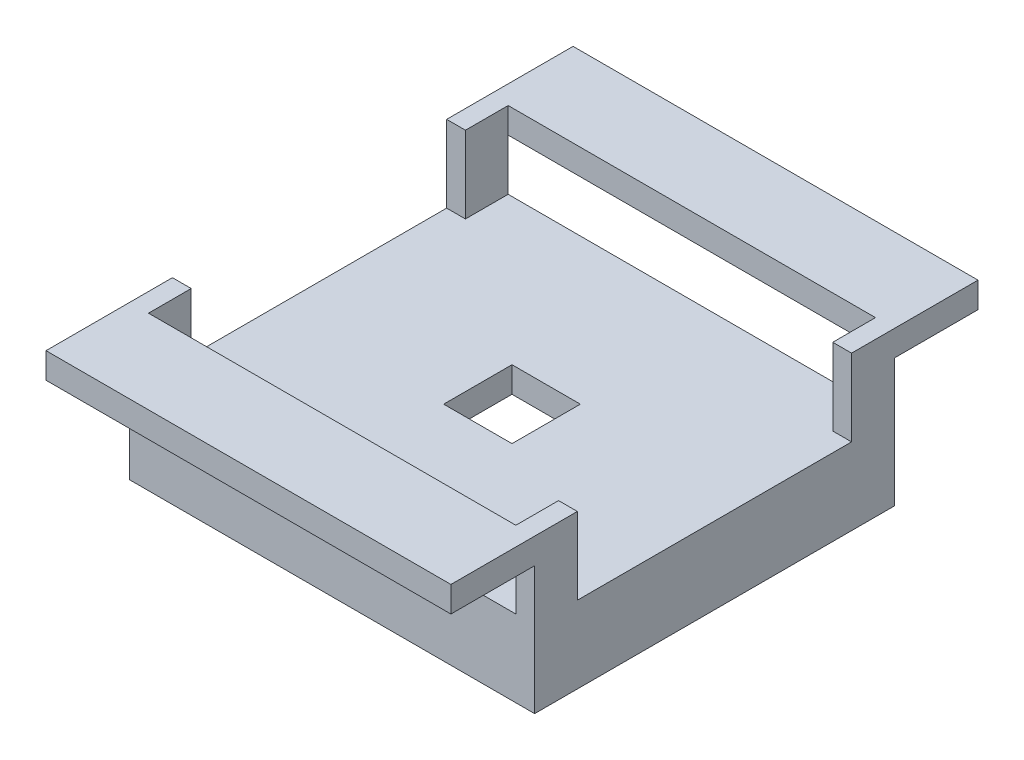
ISO-10303-21;
HEADER;
FILE_DESCRIPTION(('STEP AP214'),'2;1');
FILE_NAME('part.step','',(''),(''),'','','');
FILE_SCHEMA(('AUTOMOTIVE_DESIGN { 1 0 10303 214 1 1 1 1 }'));
ENDSEC;
DATA;
#1=APPLICATION_CONTEXT('core data for automotive mechanical design processes');
#2=APPLICATION_PROTOCOL_DEFINITION('international standard','automotive_design',2000,#1);
#3=PRODUCT_CONTEXT('',#1,'mechanical');
#4=PRODUCT('Part','Part','',(#3));
#5=PRODUCT_RELATED_PRODUCT_CATEGORY('part','',(#4));
#6=PRODUCT_DEFINITION_FORMATION('','',#4);
#7=PRODUCT_DEFINITION_CONTEXT('part definition',#1,'design');
#8=PRODUCT_DEFINITION('design','',#6,#7);
#9=PRODUCT_DEFINITION_SHAPE('','',#8);
#10=(LENGTH_UNIT() NAMED_UNIT(*) SI_UNIT(.MILLI.,.METRE.));
#11=(NAMED_UNIT(*) PLANE_ANGLE_UNIT() SI_UNIT($,.RADIAN.));
#12=(NAMED_UNIT(*) SI_UNIT($,.STERADIAN.) SOLID_ANGLE_UNIT());
#13=UNCERTAINTY_MEASURE_WITH_UNIT(LENGTH_MEASURE(1.E-05),#10,'distance_accuracy_value','');
#14=(GEOMETRIC_REPRESENTATION_CONTEXT(3) GLOBAL_UNCERTAINTY_ASSIGNED_CONTEXT((#13)) GLOBAL_UNIT_ASSIGNED_CONTEXT((#10,
#11,#12)) REPRESENTATION_CONTEXT('',''));
#15=CARTESIAN_POINT('',(0.,0.,0.));
#16=DIRECTION('',(0.,0.,1.));
#17=DIRECTION('',(1.,0.,0.));
#18=AXIS2_PLACEMENT_3D('',#15,#16,#17);
#19=CARTESIAN_POINT('',(-23.7,-1.,21.05));
#20=DIRECTION('',(0.,0.,1.));
#21=DIRECTION('',(1.,0.,0.));
#22=AXIS2_PLACEMENT_3D('',#19,#20,#21);
#23=PLANE('',#22);
#24=DIRECTION('',(0.,1.,0.));
#25=VECTOR('',#24,1.);
#26=CARTESIAN_POINT('',(23.7,-1.,21.05));
#27=LINE('',#26,#25);
#28=CARTESIAN_POINT('',(23.7,-7.,21.05));
#29=VERTEX_POINT('',#28);
#30=CARTESIAN_POINT('',(23.7,8.,21.05));
#31=VERTEX_POINT('',#30);
#32=EDGE_CURVE('E12',#29,#31,#27,.T.);
#33=ORIENTED_EDGE('',*,*,#32,.T.);
#34=DIRECTION('',(1.,0.,0.));
#35=VECTOR('',#34,1.);
#36=CARTESIAN_POINT('',(21.5,8.,21.05));
#37=LINE('',#36,#35);
#38=CARTESIAN_POINT('',(21.5,8.,21.05));
#39=VERTEX_POINT('',#38);
#40=EDGE_CURVE('E404',#39,#31,#37,.T.);
#41=ORIENTED_EDGE('',*,*,#40,.F.);
#42=DIRECTION('',(0.,-1.,0.));
#43=VECTOR('',#42,1.);
#44=CARTESIAN_POINT('',(21.5,11.,21.05));
#45=LINE('',#44,#43);
#46=CARTESIAN_POINT('',(21.5,2.,21.05));
#47=VERTEX_POINT('',#46);
#48=EDGE_CURVE('E375',#39,#47,#45,.T.);
#49=ORIENTED_EDGE('',*,*,#48,.T.);
#50=DIRECTION('',(1.,0.,0.));
#51=VECTOR('',#50,1.);
#52=CARTESIAN_POINT('',(-23.7,2.,21.05));
#53=LINE('',#52,#51);
#54=CARTESIAN_POINT('',(-21.5,2.,21.05));
#55=VERTEX_POINT('',#54);
#56=EDGE_CURVE('E185',#55,#47,#53,.T.);
#57=ORIENTED_EDGE('',*,*,#56,.F.);
#58=DIRECTION('',(0.,-1.,0.));
#59=VECTOR('',#58,1.);
#60=CARTESIAN_POINT('',(-21.5,11.,21.05));
#61=LINE('',#60,#59);
#62=CARTESIAN_POINT('',(-21.5,8.,21.05));
#63=VERTEX_POINT('',#62);
#64=EDGE_CURVE('E313',#63,#55,#61,.T.);
#65=ORIENTED_EDGE('',*,*,#64,.F.);
#66=DIRECTION('',(-1.,0.,0.));
#67=VECTOR('',#66,1.);
#68=CARTESIAN_POINT('',(-21.5,8.,21.05));
#69=LINE('',#68,#67);
#70=CARTESIAN_POINT('',(-23.7,8.,21.05));
#71=VERTEX_POINT('',#70);
#72=EDGE_CURVE('E352',#63,#71,#69,.T.);
#73=ORIENTED_EDGE('',*,*,#72,.T.);
#74=DIRECTION('',(0.,1.,0.));
#75=VECTOR('',#74,1.);
#76=CARTESIAN_POINT('',(-23.7,-1.,21.05));
#77=LINE('',#76,#75);
#78=CARTESIAN_POINT('',(-23.7,-7.,21.05));
#79=VERTEX_POINT('',#78);
#80=EDGE_CURVE('E64',#79,#71,#77,.T.);
#81=ORIENTED_EDGE('',*,*,#80,.F.);
#82=DIRECTION('',(1.,0.,0.));
#83=VECTOR('',#82,1.);
#84=CARTESIAN_POINT('',(0.,-7.,21.05));
#85=LINE('',#84,#83);
#86=EDGE_CURVE('E156',#29,#79,#85,.F.);
#87=ORIENTED_EDGE('',*,*,#86,.F.);
#88=EDGE_LOOP('',(#33,#41,#49,#57,#65,#73,#81,#87));
#89=FACE_BOUND('',#88,.T.);
#90=ADVANCED_FACE('F53',(#89),#23,.T.);
#91=CARTESIAN_POINT('',(0.,2.,0.));
#92=DIRECTION('',(0.,-1.,0.));
#93=DIRECTION('',(0.,0.,-1.));
#94=AXIS2_PLACEMENT_3D('',#91,#92,#93);
#95=PLANE('',#94);
#96=DIRECTION('',(1.,0.,0.));
#97=VECTOR('',#96,1.);
#98=CARTESIAN_POINT('',(-4.,2.,-4.));
#99=LINE('',#98,#97);
#100=CARTESIAN_POINT('',(-4.,2.,-4.));
#101=VERTEX_POINT('',#100);
#102=CARTESIAN_POINT('',(4.,2.,-4.));
#103=VERTEX_POINT('',#102);
#104=EDGE_CURVE('E174',#101,#103,#99,.T.);
#105=ORIENTED_EDGE('',*,*,#104,.T.);
#106=DIRECTION('',(0.,0.,1.));
#107=VECTOR('',#106,1.);
#108=CARTESIAN_POINT('',(4.,2.,4.));
#109=LINE('',#108,#107);
#110=CARTESIAN_POINT('',(4.,2.,4.));
#111=VERTEX_POINT('',#110);
#112=EDGE_CURVE('E135',#103,#111,#109,.T.);
#113=ORIENTED_EDGE('',*,*,#112,.T.);
#114=DIRECTION('',(-1.,0.,0.));
#115=VECTOR('',#114,1.);
#116=CARTESIAN_POINT('',(-4.,2.,4.));
#117=LINE('',#116,#115);
#118=CARTESIAN_POINT('',(-4.,2.,4.));
#119=VERTEX_POINT('',#118);
#120=EDGE_CURVE('E149',#111,#119,#117,.T.);
#121=ORIENTED_EDGE('',*,*,#120,.T.);
#122=DIRECTION('',(0.,0.,-1.));
#123=VECTOR('',#122,1.);
#124=CARTESIAN_POINT('',(-4.,2.,4.));
#125=LINE('',#124,#123);
#126=EDGE_CURVE('E73',#119,#101,#125,.T.);
#127=ORIENTED_EDGE('',*,*,#126,.T.);
#128=EDGE_LOOP('',(#105,#113,#121,#127));
#129=FACE_BOUND('',#128,.T.);
#130=DIRECTION('',(-1.,0.,0.));
#131=VECTOR('',#130,1.);
#132=CARTESIAN_POINT('',(23.7,2.,16.05));
#133=LINE('',#132,#131);
#134=CARTESIAN_POINT('',(23.7,2.,16.05));
#135=VERTEX_POINT('',#134);
#136=CARTESIAN_POINT('',(21.5,2.,16.05));
#137=VERTEX_POINT('',#136);
#138=EDGE_CURVE('E385',#135,#137,#133,.T.);
#139=ORIENTED_EDGE('',*,*,#138,.F.);
#140=DIRECTION('',(0.,0.,-1.));
#141=VECTOR('',#140,1.);
#142=CARTESIAN_POINT('',(23.7,2.,21.05));
#143=LINE('',#142,#141);
#144=CARTESIAN_POINT('',(23.7,2.,-16.05));
#145=VERTEX_POINT('',#144);
#146=EDGE_CURVE('E200',#135,#145,#143,.T.);
#147=ORIENTED_EDGE('',*,*,#146,.T.);
#148=DIRECTION('',(-1.,0.,0.));
#149=VECTOR('',#148,1.);
#150=CARTESIAN_POINT('',(23.7,2.,-16.05));
#151=LINE('',#150,#149);
#152=CARTESIAN_POINT('',(21.5,2.,-16.05));
#153=VERTEX_POINT('',#152);
#154=EDGE_CURVE('E269',#145,#153,#151,.T.);
#155=ORIENTED_EDGE('',*,*,#154,.T.);
#156=DIRECTION('',(0.,0.,-1.));
#157=VECTOR('',#156,1.);
#158=CARTESIAN_POINT('',(21.5,2.,-21.05));
#159=LINE('',#158,#157);
#160=CARTESIAN_POINT('',(21.5,2.,-21.05));
#161=VERTEX_POINT('',#160);
#162=EDGE_CURVE('E274',#153,#161,#159,.T.);
#163=ORIENTED_EDGE('',*,*,#162,.T.);
#164=DIRECTION('',(-1.,0.,0.));
#165=VECTOR('',#164,1.);
#166=CARTESIAN_POINT('',(-23.7,2.,-21.05));
#167=LINE('',#166,#165);
#168=CARTESIAN_POINT('',(-21.5,2.,-21.05));
#169=VERTEX_POINT('',#168);
#170=EDGE_CURVE('E196',#161,#169,#167,.T.);
#171=ORIENTED_EDGE('',*,*,#170,.T.);
#172=DIRECTION('',(0.,0.,-1.));
#173=VECTOR('',#172,1.);
#174=CARTESIAN_POINT('',(-21.5,2.,-21.05));
#175=LINE('',#174,#173);
#176=CARTESIAN_POINT('',(-21.5,2.,-16.05));
#177=VERTEX_POINT('',#176);
#178=EDGE_CURVE('E217',#177,#169,#175,.T.);
#179=ORIENTED_EDGE('',*,*,#178,.F.);
#180=DIRECTION('',(1.,0.,0.));
#181=VECTOR('',#180,1.);
#182=CARTESIAN_POINT('',(-23.7,2.,-16.05));
#183=LINE('',#182,#181);
#184=CARTESIAN_POINT('',(-23.7,2.,-16.05));
#185=VERTEX_POINT('',#184);
#186=EDGE_CURVE('E222',#185,#177,#183,.T.);
#187=ORIENTED_EDGE('',*,*,#186,.F.);
#188=DIRECTION('',(0.,0.,1.));
#189=VECTOR('',#188,1.);
#190=CARTESIAN_POINT('',(-23.7,2.,21.05));
#191=LINE('',#190,#189);
#192=CARTESIAN_POINT('',(-23.7,2.,16.05));
#193=VERTEX_POINT('',#192);
#194=EDGE_CURVE('E192',#185,#193,#191,.T.);
#195=ORIENTED_EDGE('',*,*,#194,.T.);
#196=DIRECTION('',(1.,0.,0.));
#197=VECTOR('',#196,1.);
#198=CARTESIAN_POINT('',(-23.7,2.,16.05));
#199=LINE('',#198,#197);
#200=CARTESIAN_POINT('',(-21.5,2.,16.05));
#201=VERTEX_POINT('',#200);
#202=EDGE_CURVE('E329',#193,#201,#199,.T.);
#203=ORIENTED_EDGE('',*,*,#202,.T.);
#204=DIRECTION('',(0.,0.,1.));
#205=VECTOR('',#204,1.);
#206=CARTESIAN_POINT('',(-21.5,2.,21.05));
#207=LINE('',#206,#205);
#208=EDGE_CURVE('E334',#201,#55,#207,.T.);
#209=ORIENTED_EDGE('',*,*,#208,.T.);
#210=ORIENTED_EDGE('',*,*,#56,.T.);
#211=DIRECTION('',(0.,0.,1.));
#212=VECTOR('',#211,1.);
#213=CARTESIAN_POINT('',(21.5,2.,21.05));
#214=LINE('',#213,#212);
#215=EDGE_CURVE('E380',#137,#47,#214,.T.);
#216=ORIENTED_EDGE('',*,*,#215,.F.);
#217=EDGE_LOOP('',(#139,#147,#155,#163,#171,#179,#187,#195,#203,#209,#210,#216));
#218=FACE_BOUND('',#217,.T.);
#219=ADVANCED_FACE('F549',(#129,#218),#95,.F.);
#220=CARTESIAN_POINT('',(-21.5,11.,-21.05));
#221=DIRECTION('',(-1.,0.,0.));
#222=DIRECTION('',(0.,0.,1.));
#223=AXIS2_PLACEMENT_3D('',#220,#221,#222);
#224=PLANE('',#223);
#225=DIRECTION('',(0.,-1.,0.));
#226=VECTOR('',#225,1.);
#227=CARTESIAN_POINT('',(-21.5,8.,-21.05));
#228=LINE('',#227,#226);
#229=CARTESIAN_POINT('',(-21.5,11.,-21.05));
#230=VERTEX_POINT('',#229);
#231=CARTESIAN_POINT('',(-21.5,8.,-21.05));
#232=VERTEX_POINT('',#231);
#233=EDGE_CURVE('E309',#230,#232,#228,.T.);
#234=ORIENTED_EDGE('',*,*,#233,.F.);
#235=DIRECTION('',(0.,0.,-1.));
#236=VECTOR('',#235,1.);
#237=CARTESIAN_POINT('',(-21.5,11.,-21.05));
#238=LINE('',#237,#236);
#239=CARTESIAN_POINT('',(-21.5,11.,-16.05));
#240=VERTEX_POINT('',#239);
#241=EDGE_CURVE('E216',#240,#230,#238,.T.);
#242=ORIENTED_EDGE('',*,*,#241,.F.);
#243=DIRECTION('',(0.,-1.,0.));
#244=VECTOR('',#243,1.);
#245=CARTESIAN_POINT('',(-21.5,11.,-16.05));
#246=LINE('',#245,#244);
#247=EDGE_CURVE('E208',#240,#177,#246,.T.);
#248=ORIENTED_EDGE('',*,*,#247,.T.);
#249=ORIENTED_EDGE('',*,*,#178,.T.);
#250=DIRECTION('',(0.,-1.,0.));
#251=VECTOR('',#250,1.);
#252=CARTESIAN_POINT('',(-21.5,11.,-21.05));
#253=LINE('',#252,#251);
#254=EDGE_CURVE('E212',#232,#169,#253,.T.);
#255=ORIENTED_EDGE('',*,*,#254,.F.);
#256=EDGE_LOOP('',(#234,#242,#248,#249,#255));
#257=FACE_BOUND('',#256,.T.);
#258=ADVANCED_FACE('F590',(#257),#224,.F.);
#259=CARTESIAN_POINT('',(21.5,11.,-21.05));
#260=DIRECTION('',(-1.,0.,0.));
#261=DIRECTION('',(0.,0.,1.));
#262=AXIS2_PLACEMENT_3D('',#259,#260,#261);
#263=PLANE('',#262);
#264=DIRECTION('',(0.,0.,-1.));
#265=VECTOR('',#264,1.);
#266=CARTESIAN_POINT('',(21.5,11.,-21.05));
#267=LINE('',#266,#265);
#268=CARTESIAN_POINT('',(21.5,11.,-16.05));
#269=VERTEX_POINT('',#268);
#270=CARTESIAN_POINT('',(21.5,11.,-21.05));
#271=VERTEX_POINT('',#270);
#272=EDGE_CURVE('E282',#269,#271,#267,.T.);
#273=ORIENTED_EDGE('',*,*,#272,.T.);
#274=DIRECTION('',(0.,1.,0.));
#275=VECTOR('',#274,1.);
#276=CARTESIAN_POINT('',(21.5,8.,-21.05));
#277=LINE('',#276,#275);
#278=CARTESIAN_POINT('',(21.5,8.,-21.05));
#279=VERTEX_POINT('',#278);
#280=EDGE_CURVE('E297',#279,#271,#277,.T.);
#281=ORIENTED_EDGE('',*,*,#280,.F.);
#282=DIRECTION('',(0.,-1.,0.));
#283=VECTOR('',#282,1.);
#284=CARTESIAN_POINT('',(21.5,11.,-21.05));
#285=LINE('',#284,#283);
#286=EDGE_CURVE('E246',#279,#161,#285,.T.);
#287=ORIENTED_EDGE('',*,*,#286,.T.);
#288=ORIENTED_EDGE('',*,*,#162,.F.);
#289=DIRECTION('',(0.,-1.,0.));
#290=VECTOR('',#289,1.);
#291=CARTESIAN_POINT('',(21.5,11.,-16.05));
#292=LINE('',#291,#290);
#293=EDGE_CURVE('E260',#269,#153,#292,.T.);
#294=ORIENTED_EDGE('',*,*,#293,.F.);
#295=EDGE_LOOP('',(#273,#281,#287,#288,#294));
#296=FACE_BOUND('',#295,.T.);
#297=ADVANCED_FACE('F574',(#296),#263,.T.);
#298=CARTESIAN_POINT('',(23.7,-1.,21.05));
#299=DIRECTION('',(1.,0.,0.));
#300=DIRECTION('',(0.,0.,-1.));
#301=AXIS2_PLACEMENT_3D('',#298,#299,#300);
#302=PLANE('',#301);
#303=DIRECTION('',(0.,1.,0.));
#304=VECTOR('',#303,1.);
#305=CARTESIAN_POINT('',(23.7,-1.,-21.05));
#306=LINE('',#305,#304);
#307=CARTESIAN_POINT('',(23.7,-7.,-21.05));
#308=VERTEX_POINT('',#307);
#309=CARTESIAN_POINT('',(23.7,8.,-21.05));
#310=VERTEX_POINT('',#309);
#311=EDGE_CURVE('E181',#308,#310,#306,.T.);
#312=ORIENTED_EDGE('',*,*,#311,.T.);
#313=DIRECTION('',(0.,0.,1.));
#314=VECTOR('',#313,1.);
#315=CARTESIAN_POINT('',(23.7,8.,-30.85));
#316=LINE('',#315,#314);
#317=CARTESIAN_POINT('',(23.7,8.,-30.85));
#318=VERTEX_POINT('',#317);
#319=EDGE_CURVE('E278',#318,#310,#316,.T.);
#320=ORIENTED_EDGE('',*,*,#319,.F.);
#321=DIRECTION('',(0.,1.,0.));
#322=VECTOR('',#321,1.);
#323=CARTESIAN_POINT('',(23.7,11.,-30.85));
#324=LINE('',#323,#322);
#325=CARTESIAN_POINT('',(23.7,11.,-30.85));
#326=VERTEX_POINT('',#325);
#327=EDGE_CURVE('E292',#318,#326,#324,.T.);
#328=ORIENTED_EDGE('',*,*,#327,.T.);
#329=DIRECTION('',(0.,0.,1.));
#330=VECTOR('',#329,1.);
#331=CARTESIAN_POINT('',(23.7,11.,-21.05));
#332=LINE('',#331,#330);
#333=CARTESIAN_POINT('',(23.7,11.,-16.05));
#334=VERTEX_POINT('',#333);
#335=EDGE_CURVE('E273',#326,#334,#332,.T.);
#336=ORIENTED_EDGE('',*,*,#335,.T.);
#337=DIRECTION('',(0.,-1.,0.));
#338=VECTOR('',#337,1.);
#339=CARTESIAN_POINT('',(23.7,11.,-16.05));
#340=LINE('',#339,#338);
#341=EDGE_CURVE('E264',#334,#145,#340,.T.);
#342=ORIENTED_EDGE('',*,*,#341,.T.);
#343=ORIENTED_EDGE('',*,*,#146,.F.);
#344=DIRECTION('',(0.,-1.,0.));
#345=VECTOR('',#344,1.);
#346=CARTESIAN_POINT('',(23.7,11.,16.05));
#347=LINE('',#346,#345);
#348=CARTESIAN_POINT('',(23.7,11.,16.05));
#349=VERTEX_POINT('',#348);
#350=EDGE_CURVE('E357',#349,#135,#347,.T.);
#351=ORIENTED_EDGE('',*,*,#350,.F.);
#352=DIRECTION('',(0.,0.,-1.));
#353=VECTOR('',#352,1.);
#354=CARTESIAN_POINT('',(23.7,11.,21.05));
#355=LINE('',#354,#353);
#356=CARTESIAN_POINT('',(23.7,11.,30.85));
#357=VERTEX_POINT('',#356);
#358=EDGE_CURVE('E384',#357,#349,#355,.T.);
#359=ORIENTED_EDGE('',*,*,#358,.F.);
#360=DIRECTION('',(0.,1.,0.));
#361=VECTOR('',#360,1.);
#362=CARTESIAN_POINT('',(23.7,11.,30.85));
#363=LINE('',#362,#361);
#364=CARTESIAN_POINT('',(23.7,8.,30.85));
#365=VERTEX_POINT('',#364);
#366=EDGE_CURVE('E403',#365,#357,#363,.T.);
#367=ORIENTED_EDGE('',*,*,#366,.F.);
#368=DIRECTION('',(0.,0.,-1.));
#369=VECTOR('',#368,1.);
#370=CARTESIAN_POINT('',(23.7,8.,30.85));
#371=LINE('',#370,#369);
#372=EDGE_CURVE('E389',#365,#31,#371,.T.);
#373=ORIENTED_EDGE('',*,*,#372,.T.);
#374=ORIENTED_EDGE('',*,*,#32,.F.);
#375=DIRECTION('',(0.,0.,1.));
#376=VECTOR('',#375,1.);
#377=CARTESIAN_POINT('',(23.7,-7.,0.));
#378=LINE('',#377,#376);
#379=EDGE_CURVE('E160',#308,#29,#378,.T.);
#380=ORIENTED_EDGE('',*,*,#379,.F.);
#381=EDGE_LOOP('',(#312,#320,#328,#336,#342,#343,#351,#359,#367,#373,#374,#380));
#382=FACE_BOUND('',#381,.T.);
#383=ADVANCED_FACE('F55',(#382),#302,.T.);
#384=CARTESIAN_POINT('',(-23.7,-1.,21.05));
#385=DIRECTION('',(-1.,0.,0.));
#386=DIRECTION('',(0.,0.,1.));
#387=AXIS2_PLACEMENT_3D('',#384,#385,#386);
#388=PLANE('',#387);
#389=ORIENTED_EDGE('',*,*,#80,.T.);
#390=DIRECTION('',(0.,0.,-1.));
#391=VECTOR('',#390,1.);
#392=CARTESIAN_POINT('',(-23.7,8.,30.85));
#393=LINE('',#392,#391);
#394=CARTESIAN_POINT('',(-23.7,8.,30.85));
#395=VERTEX_POINT('',#394);
#396=EDGE_CURVE('E338',#395,#71,#393,.T.);
#397=ORIENTED_EDGE('',*,*,#396,.F.);
#398=DIRECTION('',(0.,1.,0.));
#399=VECTOR('',#398,1.);
#400=CARTESIAN_POINT('',(-23.7,11.,30.85));
#401=LINE('',#400,#399);
#402=CARTESIAN_POINT('',(-23.7,11.,30.85));
#403=VERTEX_POINT('',#402);
#404=EDGE_CURVE('E361',#395,#403,#401,.T.);
#405=ORIENTED_EDGE('',*,*,#404,.T.);
#406=DIRECTION('',(0.,0.,-1.));
#407=VECTOR('',#406,1.);
#408=CARTESIAN_POINT('',(-23.7,11.,21.05));
#409=LINE('',#408,#407);
#410=CARTESIAN_POINT('',(-23.7,11.,16.05));
#411=VERTEX_POINT('',#410);
#412=EDGE_CURVE('E333',#403,#411,#409,.T.);
#413=ORIENTED_EDGE('',*,*,#412,.T.);
#414=DIRECTION('',(0.,-1.,0.));
#415=VECTOR('',#414,1.);
#416=CARTESIAN_POINT('',(-23.7,11.,16.05));
#417=LINE('',#416,#415);
#418=EDGE_CURVE('E324',#411,#193,#417,.T.);
#419=ORIENTED_EDGE('',*,*,#418,.T.);
#420=ORIENTED_EDGE('',*,*,#194,.F.);
#421=DIRECTION('',(0.,-1.,0.));
#422=VECTOR('',#421,1.);
#423=CARTESIAN_POINT('',(-23.7,11.,-16.05));
#424=LINE('',#423,#422);
#425=CARTESIAN_POINT('',(-23.7,11.,-16.05));
#426=VERTEX_POINT('',#425);
#427=EDGE_CURVE('E204',#426,#185,#424,.T.);
#428=ORIENTED_EDGE('',*,*,#427,.F.);
#429=DIRECTION('',(0.,0.,1.));
#430=VECTOR('',#429,1.);
#431=CARTESIAN_POINT('',(-23.7,11.,-21.05));
#432=LINE('',#431,#430);
#433=CARTESIAN_POINT('',(-23.7,11.,-30.85));
#434=VERTEX_POINT('',#433);
#435=EDGE_CURVE('E221',#434,#426,#432,.T.);
#436=ORIENTED_EDGE('',*,*,#435,.F.);
#437=DIRECTION('',(0.,1.,0.));
#438=VECTOR('',#437,1.);
#439=CARTESIAN_POINT('',(-23.7,11.,-30.85));
#440=LINE('',#439,#438);
#441=CARTESIAN_POINT('',(-23.7,8.,-30.85));
#442=VERTEX_POINT('',#441);
#443=EDGE_CURVE('E250',#442,#434,#440,.T.);
#444=ORIENTED_EDGE('',*,*,#443,.F.);
#445=DIRECTION('',(0.,0.,1.));
#446=VECTOR('',#445,1.);
#447=CARTESIAN_POINT('',(-23.7,8.,-30.85));
#448=LINE('',#447,#446);
#449=CARTESIAN_POINT('',(-23.7,8.,-21.05));
#450=VERTEX_POINT('',#449);
#451=EDGE_CURVE('E226',#442,#450,#448,.T.);
#452=ORIENTED_EDGE('',*,*,#451,.T.);
#453=DIRECTION('',(0.,1.,0.));
#454=VECTOR('',#453,1.);
#455=CARTESIAN_POINT('',(-23.7,-1.,-21.05));
#456=LINE('',#455,#454);
#457=CARTESIAN_POINT('',(-23.7,-7.,-21.05));
#458=VERTEX_POINT('',#457);
#459=EDGE_CURVE('E179',#458,#450,#456,.T.);
#460=ORIENTED_EDGE('',*,*,#459,.F.);
#461=DIRECTION('',(0.,0.,1.));
#462=VECTOR('',#461,1.);
#463=CARTESIAN_POINT('',(-23.7,-7.,0.));
#464=LINE('',#463,#462);
#465=EDGE_CURVE('E128',#79,#458,#464,.F.);
#466=ORIENTED_EDGE('',*,*,#465,.F.);
#467=EDGE_LOOP('',(#389,#397,#405,#413,#419,#420,#428,#436,#444,#452,#460,#466));
#468=FACE_BOUND('',#467,.T.);
#469=ADVANCED_FACE('F598',(#468),#388,.T.);
#470=CARTESIAN_POINT('',(-23.7,-1.,-21.05));
#471=DIRECTION('',(0.,0.,-1.));
#472=DIRECTION('',(-1.,0.,0.));
#473=AXIS2_PLACEMENT_3D('',#470,#471,#472);
#474=PLANE('',#473);
#475=DIRECTION('',(1.,0.,0.));
#476=VECTOR('',#475,1.);
#477=CARTESIAN_POINT('',(21.5,8.,-21.05));
#478=LINE('',#477,#476);
#479=EDGE_CURVE('E293',#279,#310,#478,.T.);
#480=ORIENTED_EDGE('',*,*,#479,.T.);
#481=ORIENTED_EDGE('',*,*,#311,.F.);
#482=DIRECTION('',(1.,0.,0.));
#483=VECTOR('',#482,1.);
#484=CARTESIAN_POINT('',(0.,-7.,-21.05));
#485=LINE('',#484,#483);
#486=EDGE_CURVE('E110',#458,#308,#485,.T.);
#487=ORIENTED_EDGE('',*,*,#486,.F.);
#488=ORIENTED_EDGE('',*,*,#459,.T.);
#489=DIRECTION('',(-1.,0.,0.));
#490=VECTOR('',#489,1.);
#491=CARTESIAN_POINT('',(-21.5,8.,-21.05));
#492=LINE('',#491,#490);
#493=EDGE_CURVE('E241',#232,#450,#492,.T.);
#494=ORIENTED_EDGE('',*,*,#493,.F.);
#495=ORIENTED_EDGE('',*,*,#254,.T.);
#496=ORIENTED_EDGE('',*,*,#170,.F.);
#497=ORIENTED_EDGE('',*,*,#286,.F.);
#498=EDGE_LOOP('',(#480,#481,#487,#488,#494,#495,#496,#497));
#499=FACE_BOUND('',#498,.T.);
#500=ADVANCED_FACE('F579',(#499),#474,.T.);
#501=CARTESIAN_POINT('',(-23.7,11.,-16.05));
#502=DIRECTION('',(0.,0.,-1.));
#503=DIRECTION('',(-1.,0.,0.));
#504=AXIS2_PLACEMENT_3D('',#501,#502,#503);
#505=PLANE('',#504);
#506=ORIENTED_EDGE('',*,*,#186,.T.);
#507=ORIENTED_EDGE('',*,*,#247,.F.);
#508=DIRECTION('',(1.,0.,0.));
#509=VECTOR('',#508,1.);
#510=CARTESIAN_POINT('',(-23.7,11.,-16.05));
#511=LINE('',#510,#509);
#512=EDGE_CURVE('E230',#426,#240,#511,.T.);
#513=ORIENTED_EDGE('',*,*,#512,.F.);
#514=ORIENTED_EDGE('',*,*,#427,.T.);
#515=EDGE_LOOP('',(#506,#507,#513,#514));
#516=FACE_BOUND('',#515,.T.);
#517=ADVANCED_FACE('F586',(#516),#505,.F.);
#518=CARTESIAN_POINT('',(0.,11.,0.));
#519=DIRECTION('',(0.,1.,0.));
#520=DIRECTION('',(0.,0.,1.));
#521=AXIS2_PLACEMENT_3D('',#518,#519,#520);
#522=PLANE('',#521);
#523=ORIENTED_EDGE('',*,*,#435,.T.);
#524=ORIENTED_EDGE('',*,*,#512,.T.);
#525=ORIENTED_EDGE('',*,*,#241,.T.);
#526=DIRECTION('',(-1.,0.,0.));
#527=VECTOR('',#526,1.);
#528=CARTESIAN_POINT('',(31.7489023802552,11.,-21.05));
#529=LINE('',#528,#527);
#530=EDGE_CURVE('E305',#271,#230,#529,.T.);
#531=ORIENTED_EDGE('',*,*,#530,.F.);
#532=ORIENTED_EDGE('',*,*,#272,.F.);
#533=DIRECTION('',(-1.,0.,0.));
#534=VECTOR('',#533,1.);
#535=CARTESIAN_POINT('',(23.7,11.,-16.05));
#536=LINE('',#535,#534);
#537=EDGE_CURVE('E268',#334,#269,#536,.T.);
#538=ORIENTED_EDGE('',*,*,#537,.F.);
#539=ORIENTED_EDGE('',*,*,#335,.F.);
#540=DIRECTION('',(1.,0.,0.));
#541=VECTOR('',#540,1.);
#542=CARTESIAN_POINT('',(-21.5,11.,-30.85));
#543=LINE('',#542,#541);
#544=EDGE_CURVE('E240',#434,#326,#543,.T.);
#545=ORIENTED_EDGE('',*,*,#544,.F.);
#546=EDGE_LOOP('',(#523,#524,#525,#531,#532,#538,#539,#545));
#547=FACE_BOUND('',#546,.T.);
#548=ADVANCED_FACE('F593',(#547),#522,.T.);
#549=CARTESIAN_POINT('',(-21.5,8.,-30.85));
#550=DIRECTION('',(0.,1.,0.));
#551=DIRECTION('',(0.,0.,1.));
#552=AXIS2_PLACEMENT_3D('',#549,#550,#551);
#553=PLANE('',#552);
#554=ORIENTED_EDGE('',*,*,#493,.T.);
#555=ORIENTED_EDGE('',*,*,#451,.F.);
#556=DIRECTION('',(-1.,0.,0.));
#557=VECTOR('',#556,1.);
#558=CARTESIAN_POINT('',(-21.5,8.,-30.85));
#559=LINE('',#558,#557);
#560=EDGE_CURVE('E245',#318,#442,#559,.T.);
#561=ORIENTED_EDGE('',*,*,#560,.F.);
#562=ORIENTED_EDGE('',*,*,#319,.T.);
#563=ORIENTED_EDGE('',*,*,#479,.F.);
#564=DIRECTION('',(-1.,0.,0.));
#565=VECTOR('',#564,1.);
#566=CARTESIAN_POINT('',(31.7489023802552,8.,-21.05));
#567=LINE('',#566,#565);
#568=EDGE_CURVE('E301',#279,#232,#567,.T.);
#569=ORIENTED_EDGE('',*,*,#568,.T.);
#570=EDGE_LOOP('',(#554,#555,#561,#562,#563,#569));
#571=FACE_BOUND('',#570,.T.);
#572=ADVANCED_FACE('F652',(#571),#553,.F.);
#573=CARTESIAN_POINT('',(0.,0.,-30.85));
#574=DIRECTION('',(0.,0.,-1.));
#575=DIRECTION('',(-1.,0.,0.));
#576=AXIS2_PLACEMENT_3D('',#573,#574,#575);
#577=PLANE('',#576);
#578=ORIENTED_EDGE('',*,*,#544,.T.);
#579=ORIENTED_EDGE('',*,*,#327,.F.);
#580=ORIENTED_EDGE('',*,*,#560,.T.);
#581=ORIENTED_EDGE('',*,*,#443,.T.);
#582=EDGE_LOOP('',(#578,#579,#580,#581));
#583=FACE_BOUND('',#582,.T.);
#584=ADVANCED_FACE('F659',(#583),#577,.T.);
#585=CARTESIAN_POINT('',(23.7,11.,-16.05));
#586=DIRECTION('',(0.,0.,1.));
#587=DIRECTION('',(1.,0.,0.));
#588=AXIS2_PLACEMENT_3D('',#585,#586,#587);
#589=PLANE('',#588);
#590=ORIENTED_EDGE('',*,*,#154,.F.);
#591=ORIENTED_EDGE('',*,*,#341,.F.);
#592=ORIENTED_EDGE('',*,*,#537,.T.);
#593=ORIENTED_EDGE('',*,*,#293,.T.);
#594=EDGE_LOOP('',(#590,#591,#592,#593));
#595=FACE_BOUND('',#594,.T.);
#596=ADVANCED_FACE('F570',(#595),#589,.T.);
#597=CARTESIAN_POINT('',(31.7489023802552,8.,-21.05));
#598=DIRECTION('',(0.,0.,-1.));
#599=DIRECTION('',(-1.,0.,0.));
#600=AXIS2_PLACEMENT_3D('',#597,#598,#599);
#601=PLANE('',#600);
#602=ORIENTED_EDGE('',*,*,#568,.F.);
#603=ORIENTED_EDGE('',*,*,#280,.T.);
#604=ORIENTED_EDGE('',*,*,#530,.T.);
#605=ORIENTED_EDGE('',*,*,#233,.T.);
#606=EDGE_LOOP('',(#602,#603,#604,#605));
#607=FACE_BOUND('',#606,.T.);
#608=ADVANCED_FACE('F667',(#607),#601,.F.);
#609=CARTESIAN_POINT('',(-21.5,11.,21.05));
#610=DIRECTION('',(1.,0.,0.));
#611=DIRECTION('',(0.,0.,-1.));
#612=AXIS2_PLACEMENT_3D('',#609,#610,#611);
#613=PLANE('',#612);
#614=DIRECTION('',(0.,-1.,0.));
#615=VECTOR('',#614,1.);
#616=CARTESIAN_POINT('',(-21.5,8.,21.05));
#617=LINE('',#616,#615);
#618=CARTESIAN_POINT('',(-21.5,11.,21.05));
#619=VERTEX_POINT('',#618);
#620=EDGE_CURVE('E140',#619,#63,#617,.T.);
#621=ORIENTED_EDGE('',*,*,#620,.T.);
#622=ORIENTED_EDGE('',*,*,#64,.T.);
#623=ORIENTED_EDGE('',*,*,#208,.F.);
#624=DIRECTION('',(0.,-1.,0.));
#625=VECTOR('',#624,1.);
#626=CARTESIAN_POINT('',(-21.5,11.,16.05));
#627=LINE('',#626,#625);
#628=CARTESIAN_POINT('',(-21.5,11.,16.05));
#629=VERTEX_POINT('',#628);
#630=EDGE_CURVE('E320',#629,#201,#627,.T.);
#631=ORIENTED_EDGE('',*,*,#630,.F.);
#632=DIRECTION('',(0.,0.,1.));
#633=VECTOR('',#632,1.);
#634=CARTESIAN_POINT('',(-21.5,11.,21.05));
#635=LINE('',#634,#633);
#636=EDGE_CURVE('E342',#629,#619,#635,.T.);
#637=ORIENTED_EDGE('',*,*,#636,.T.);
#638=EDGE_LOOP('',(#621,#622,#623,#631,#637));
#639=FACE_BOUND('',#638,.T.);
#640=ADVANCED_FACE('F605',(#639),#613,.T.);
#641=CARTESIAN_POINT('',(-23.7,11.,16.05));
#642=DIRECTION('',(0.,0.,-1.));
#643=DIRECTION('',(-1.,0.,0.));
#644=AXIS2_PLACEMENT_3D('',#641,#642,#643);
#645=PLANE('',#644);
#646=ORIENTED_EDGE('',*,*,#202,.F.);
#647=ORIENTED_EDGE('',*,*,#418,.F.);
#648=DIRECTION('',(1.,0.,0.));
#649=VECTOR('',#648,1.);
#650=CARTESIAN_POINT('',(-23.7,11.,16.05));
#651=LINE('',#650,#649);
#652=EDGE_CURVE('E328',#411,#629,#651,.T.);
#653=ORIENTED_EDGE('',*,*,#652,.T.);
#654=ORIENTED_EDGE('',*,*,#630,.T.);
#655=EDGE_LOOP('',(#646,#647,#653,#654));
#656=FACE_BOUND('',#655,.T.);
#657=ADVANCED_FACE('F602',(#656),#645,.T.);
#658=CARTESIAN_POINT('',(0.,11.,0.));
#659=DIRECTION('',(0.,1.,0.));
#660=DIRECTION('',(0.,0.,-1.));
#661=AXIS2_PLACEMENT_3D('',#658,#659,#660);
#662=PLANE('',#661);
#663=ORIENTED_EDGE('',*,*,#412,.F.);
#664=DIRECTION('',(1.,0.,0.));
#665=VECTOR('',#664,1.);
#666=CARTESIAN_POINT('',(-21.5,11.,30.85));
#667=LINE('',#666,#665);
#668=EDGE_CURVE('E356',#403,#357,#667,.T.);
#669=ORIENTED_EDGE('',*,*,#668,.T.);
#670=ORIENTED_EDGE('',*,*,#358,.T.);
#671=DIRECTION('',(-1.,0.,0.));
#672=VECTOR('',#671,1.);
#673=CARTESIAN_POINT('',(23.7,11.,16.05));
#674=LINE('',#673,#672);
#675=CARTESIAN_POINT('',(21.5,11.,16.05));
#676=VERTEX_POINT('',#675);
#677=EDGE_CURVE('E393',#349,#676,#674,.T.);
#678=ORIENTED_EDGE('',*,*,#677,.T.);
#679=DIRECTION('',(0.,0.,1.));
#680=VECTOR('',#679,1.);
#681=CARTESIAN_POINT('',(21.5,11.,21.05));
#682=LINE('',#681,#680);
#683=CARTESIAN_POINT('',(21.5,11.,21.05));
#684=VERTEX_POINT('',#683);
#685=EDGE_CURVE('E379',#676,#684,#682,.T.);
#686=ORIENTED_EDGE('',*,*,#685,.T.);
#687=DIRECTION('',(-1.,0.,0.));
#688=VECTOR('',#687,1.);
#689=CARTESIAN_POINT('',(31.7489023802552,11.,21.05));
#690=LINE('',#689,#688);
#691=EDGE_CURVE('E412',#684,#619,#690,.T.);
#692=ORIENTED_EDGE('',*,*,#691,.T.);
#693=ORIENTED_EDGE('',*,*,#636,.F.);
#694=ORIENTED_EDGE('',*,*,#652,.F.);
#695=EDGE_LOOP('',(#663,#669,#670,#678,#686,#692,#693,#694));
#696=FACE_BOUND('',#695,.T.);
#697=ADVANCED_FACE('F560',(#696),#662,.T.);
#698=CARTESIAN_POINT('',(-21.5,8.,30.85));
#699=DIRECTION('',(0.,-1.,0.));
#700=DIRECTION('',(0.,0.,-1.));
#701=AXIS2_PLACEMENT_3D('',#698,#699,#700);
#702=PLANE('',#701);
#703=ORIENTED_EDGE('',*,*,#72,.F.);
#704=DIRECTION('',(-1.,0.,0.));
#705=VECTOR('',#704,1.);
#706=CARTESIAN_POINT('',(31.7489023802552,8.,21.05));
#707=LINE('',#706,#705);
#708=EDGE_CURVE('E416',#39,#63,#707,.T.);
#709=ORIENTED_EDGE('',*,*,#708,.F.);
#710=ORIENTED_EDGE('',*,*,#40,.T.);
#711=ORIENTED_EDGE('',*,*,#372,.F.);
#712=DIRECTION('',(-1.,0.,0.));
#713=VECTOR('',#712,1.);
#714=CARTESIAN_POINT('',(-21.5,8.,30.85));
#715=LINE('',#714,#713);
#716=EDGE_CURVE('E351',#365,#395,#715,.T.);
#717=ORIENTED_EDGE('',*,*,#716,.T.);
#718=ORIENTED_EDGE('',*,*,#396,.T.);
#719=EDGE_LOOP('',(#703,#709,#710,#711,#717,#718));
#720=FACE_BOUND('',#719,.T.);
#721=ADVANCED_FACE('F614',(#720),#702,.T.);
#722=CARTESIAN_POINT('',(0.,0.,30.85));
#723=DIRECTION('',(0.,0.,1.));
#724=DIRECTION('',(-1.,0.,0.));
#725=AXIS2_PLACEMENT_3D('',#722,#723,#724);
#726=PLANE('',#725);
#727=ORIENTED_EDGE('',*,*,#716,.F.);
#728=ORIENTED_EDGE('',*,*,#366,.T.);
#729=ORIENTED_EDGE('',*,*,#668,.F.);
#730=ORIENTED_EDGE('',*,*,#404,.F.);
#731=EDGE_LOOP('',(#727,#728,#729,#730));
#732=FACE_BOUND('',#731,.T.);
#733=ADVANCED_FACE('F620',(#732),#726,.T.);
#734=CARTESIAN_POINT('',(23.7,11.,16.05));
#735=DIRECTION('',(0.,0.,1.));
#736=DIRECTION('',(1.,0.,0.));
#737=AXIS2_PLACEMENT_3D('',#734,#735,#736);
#738=PLANE('',#737);
#739=ORIENTED_EDGE('',*,*,#138,.T.);
#740=DIRECTION('',(0.,-1.,0.));
#741=VECTOR('',#740,1.);
#742=CARTESIAN_POINT('',(21.5,11.,16.05));
#743=LINE('',#742,#741);
#744=EDGE_CURVE('E371',#676,#137,#743,.T.);
#745=ORIENTED_EDGE('',*,*,#744,.F.);
#746=ORIENTED_EDGE('',*,*,#677,.F.);
#747=ORIENTED_EDGE('',*,*,#350,.T.);
#748=EDGE_LOOP('',(#739,#745,#746,#747));
#749=FACE_BOUND('',#748,.T.);
#750=ADVANCED_FACE('F555',(#749),#738,.F.);
#751=CARTESIAN_POINT('',(21.5,11.,21.05));
#752=DIRECTION('',(1.,0.,0.));
#753=DIRECTION('',(0.,0.,-1.));
#754=AXIS2_PLACEMENT_3D('',#751,#752,#753);
#755=PLANE('',#754);
#756=ORIENTED_EDGE('',*,*,#48,.F.);
#757=DIRECTION('',(0.,1.,0.));
#758=VECTOR('',#757,1.);
#759=CARTESIAN_POINT('',(21.5,8.,21.05));
#760=LINE('',#759,#758);
#761=EDGE_CURVE('E408',#39,#684,#760,.T.);
#762=ORIENTED_EDGE('',*,*,#761,.T.);
#763=ORIENTED_EDGE('',*,*,#685,.F.);
#764=ORIENTED_EDGE('',*,*,#744,.T.);
#765=ORIENTED_EDGE('',*,*,#215,.T.);
#766=EDGE_LOOP('',(#756,#762,#763,#764,#765));
#767=FACE_BOUND('',#766,.T.);
#768=ADVANCED_FACE('F558',(#767),#755,.F.);
#769=CARTESIAN_POINT('',(31.7489023802552,8.,21.05));
#770=DIRECTION('',(0.,0.,-1.));
#771=DIRECTION('',(-1.,0.,0.));
#772=AXIS2_PLACEMENT_3D('',#769,#770,#771);
#773=PLANE('',#772);
#774=ORIENTED_EDGE('',*,*,#761,.F.);
#775=ORIENTED_EDGE('',*,*,#708,.T.);
#776=ORIENTED_EDGE('',*,*,#620,.F.);
#777=ORIENTED_EDGE('',*,*,#691,.F.);
#778=EDGE_LOOP('',(#774,#775,#776,#777));
#779=FACE_BOUND('',#778,.T.);
#780=ADVANCED_FACE('F611',(#779),#773,.T.);
#781=CARTESIAN_POINT('',(4.,2.,4.));
#782=DIRECTION('',(1.,0.,0.));
#783=DIRECTION('',(0.,0.,-1.));
#784=AXIS2_PLACEMENT_3D('',#781,#782,#783);
#785=PLANE('',#784);
#786=DIRECTION('',(0.,0.,-1.));
#787=VECTOR('',#786,1.);
#788=CARTESIAN_POINT('',(4.,-1.,4.));
#789=LINE('',#788,#787);
#790=CARTESIAN_POINT('',(4.,-1.,-4.));
#791=VERTEX_POINT('',#790);
#792=CARTESIAN_POINT('',(4.,-0.999999999999999,4.));
#793=VERTEX_POINT('',#792);
#794=EDGE_CURVE('E57',#791,#793,#789,.F.);
#795=ORIENTED_EDGE('',*,*,#794,.T.);
#796=DIRECTION('',(0.,-1.,0.));
#797=VECTOR('',#796,1.);
#798=CARTESIAN_POINT('',(4.,2.,4.));
#799=LINE('',#798,#797);
#800=EDGE_CURVE('E171',#111,#793,#799,.T.);
#801=ORIENTED_EDGE('',*,*,#800,.F.);
#802=ORIENTED_EDGE('',*,*,#112,.F.);
#803=DIRECTION('',(0.,-1.,0.));
#804=VECTOR('',#803,1.);
#805=CARTESIAN_POINT('',(4.,2.,-4.));
#806=LINE('',#805,#804);
#807=EDGE_CURVE('E131',#103,#791,#806,.T.);
#808=ORIENTED_EDGE('',*,*,#807,.T.);
#809=EDGE_LOOP('',(#795,#801,#802,#808));
#810=FACE_BOUND('',#809,.T.);
#811=ADVANCED_FACE('F132',(#810),#785,.F.);
#812=CARTESIAN_POINT('',(-4.,2.,-4.));
#813=DIRECTION('',(0.,0.,-1.));
#814=DIRECTION('',(-1.,0.,0.));
#815=AXIS2_PLACEMENT_3D('',#812,#813,#814);
#816=PLANE('',#815);
#817=DIRECTION('',(-1.,0.,0.));
#818=VECTOR('',#817,1.);
#819=CARTESIAN_POINT('',(-4.,-1.,-4.));
#820=LINE('',#819,#818);
#821=CARTESIAN_POINT('',(-4.,-1.,-4.));
#822=VERTEX_POINT('',#821);
#823=EDGE_CURVE('E107',#822,#791,#820,.F.);
#824=ORIENTED_EDGE('',*,*,#823,.T.);
#825=ORIENTED_EDGE('',*,*,#807,.F.);
#826=ORIENTED_EDGE('',*,*,#104,.F.);
#827=DIRECTION('',(0.,-1.,0.));
#828=VECTOR('',#827,1.);
#829=CARTESIAN_POINT('',(-4.,2.,-4.));
#830=LINE('',#829,#828);
#831=EDGE_CURVE('E141',#101,#822,#830,.T.);
#832=ORIENTED_EDGE('',*,*,#831,.T.);
#833=EDGE_LOOP('',(#824,#825,#826,#832));
#834=FACE_BOUND('',#833,.T.);
#835=ADVANCED_FACE('F143',(#834),#816,.F.);
#836=CARTESIAN_POINT('',(-4.,2.,4.));
#837=DIRECTION('',(-1.,0.,0.));
#838=DIRECTION('',(0.,0.,1.));
#839=AXIS2_PLACEMENT_3D('',#836,#837,#838);
#840=PLANE('',#839);
#841=DIRECTION('',(0.,0.,1.));
#842=VECTOR('',#841,1.);
#843=CARTESIAN_POINT('',(-4.,-1.,4.));
#844=LINE('',#843,#842);
#845=CARTESIAN_POINT('',(-4.,-1.,4.));
#846=VERTEX_POINT('',#845);
#847=EDGE_CURVE('E146',#846,#822,#844,.F.);
#848=ORIENTED_EDGE('',*,*,#847,.T.);
#849=ORIENTED_EDGE('',*,*,#831,.F.);
#850=ORIENTED_EDGE('',*,*,#126,.F.);
#851=DIRECTION('',(0.,-1.,0.));
#852=VECTOR('',#851,1.);
#853=CARTESIAN_POINT('',(-4.,2.,4.));
#854=LINE('',#853,#852);
#855=EDGE_CURVE('E169',#119,#846,#854,.T.);
#856=ORIENTED_EDGE('',*,*,#855,.T.);
#857=EDGE_LOOP('',(#848,#849,#850,#856));
#858=FACE_BOUND('',#857,.T.);
#859=ADVANCED_FACE('F445',(#858),#840,.F.);
#860=CARTESIAN_POINT('',(-4.,2.,4.));
#861=DIRECTION('',(0.,0.,1.));
#862=DIRECTION('',(1.,0.,0.));
#863=AXIS2_PLACEMENT_3D('',#860,#861,#862);
#864=PLANE('',#863);
#865=DIRECTION('',(1.,0.,0.));
#866=VECTOR('',#865,1.);
#867=CARTESIAN_POINT('',(-4.,-1.,4.));
#868=LINE('',#867,#866);
#869=EDGE_CURVE('E127',#793,#846,#868,.F.);
#870=ORIENTED_EDGE('',*,*,#869,.T.);
#871=ORIENTED_EDGE('',*,*,#855,.F.);
#872=ORIENTED_EDGE('',*,*,#120,.F.);
#873=ORIENTED_EDGE('',*,*,#800,.T.);
#874=EDGE_LOOP('',(#870,#871,#872,#873));
#875=FACE_BOUND('',#874,.T.);
#876=ADVANCED_FACE('F448',(#875),#864,.F.);
#877=CARTESIAN_POINT('',(0.,0.36270766216971,0.127639060001071));
#878=DIRECTION('',(0.,-0.943296350970611,-0.331951795062972));
#879=DIRECTION('',(0.,0.331951795062972,-0.943296350970611));
#880=AXIS2_PLACEMENT_3D('',#877,#878,#879);
#881=PLANE('',#880);
#882=DIRECTION('',(-0.736845155724116,0.22441984438298,-0.637726391121634));
#883=VECTOR('',#882,1.);
#884=CARTESIAN_POINT('',(23.7,-7.,21.05));
#885=LINE('',#884,#883);
#886=EDGE_CURVE('E122',#29,#793,#885,.T.);
#887=ORIENTED_EDGE('',*,*,#886,.F.);
#888=ORIENTED_EDGE('',*,*,#86,.T.);
#889=DIRECTION('',(0.736845155724116,0.224419844382979,-0.637726391121633));
#890=VECTOR('',#889,1.);
#891=CARTESIAN_POINT('',(-23.7,-7.,21.05));
#892=LINE('',#891,#890);
#893=EDGE_CURVE('E116',#79,#846,#892,.T.);
#894=ORIENTED_EDGE('',*,*,#893,.T.);
#895=ORIENTED_EDGE('',*,*,#869,.F.);
#896=EDGE_LOOP('',(#887,#888,#894,#895));
#897=FACE_BOUND('',#896,.T.);
#898=ADVANCED_FACE('F441',(#897),#881,.T.);
#899=CARTESIAN_POINT('',(-0.0608361432714753,0.199745337074677,0.));
#900=DIRECTION('',(0.291354838254235,-0.956615052268073,0.));
#901=DIRECTION('',(0.956615052268073,0.291354838254235,0.));
#902=AXIS2_PLACEMENT_3D('',#899,#900,#901);
#903=PLANE('',#902);
#904=ORIENTED_EDGE('',*,*,#893,.F.);
#905=ORIENTED_EDGE('',*,*,#465,.T.);
#906=DIRECTION('',(0.736845155724116,0.224419844382979,0.637726391121633));
#907=VECTOR('',#906,1.);
#908=CARTESIAN_POINT('',(-23.7,-7.,-21.05));
#909=LINE('',#908,#907);
#910=EDGE_CURVE('E115',#458,#822,#909,.T.);
#911=ORIENTED_EDGE('',*,*,#910,.T.);
#912=ORIENTED_EDGE('',*,*,#847,.F.);
#913=EDGE_LOOP('',(#904,#905,#911,#912));
#914=FACE_BOUND('',#913,.T.);
#915=ADVANCED_FACE('F623',(#914),#903,.T.);
#916=CARTESIAN_POINT('',(0.0608361432714757,0.199745337074679,0.));
#917=DIRECTION('',(-0.291354838254236,-0.956615052268073,0.));
#918=DIRECTION('',(0.956615052268073,-0.291354838254236,0.));
#919=AXIS2_PLACEMENT_3D('',#916,#917,#918);
#920=PLANE('',#919);
#921=DIRECTION('',(-0.736845155724116,0.22441984438298,0.637726391121634));
#922=VECTOR('',#921,1.);
#923=CARTESIAN_POINT('',(23.7,-7.,-21.05));
#924=LINE('',#923,#922);
#925=EDGE_CURVE('E103',#308,#791,#924,.T.);
#926=ORIENTED_EDGE('',*,*,#925,.F.);
#927=ORIENTED_EDGE('',*,*,#379,.T.);
#928=ORIENTED_EDGE('',*,*,#886,.T.);
#929=ORIENTED_EDGE('',*,*,#794,.F.);
#930=EDGE_LOOP('',(#926,#927,#928,#929));
#931=FACE_BOUND('',#930,.T.);
#932=ADVANCED_FACE('F121',(#931),#920,.T.);
#933=CARTESIAN_POINT('',(0.,0.362707662169711,-0.127639060001071));
#934=DIRECTION('',(0.,-0.943296350970611,0.331951795062972));
#935=DIRECTION('',(0.,-0.331951795062972,-0.943296350970611));
#936=AXIS2_PLACEMENT_3D('',#933,#934,#935);
#937=PLANE('',#936);
#938=ORIENTED_EDGE('',*,*,#910,.F.);
#939=ORIENTED_EDGE('',*,*,#486,.T.);
#940=ORIENTED_EDGE('',*,*,#925,.T.);
#941=ORIENTED_EDGE('',*,*,#823,.F.);
#942=EDGE_LOOP('',(#938,#939,#940,#941));
#943=FACE_BOUND('',#942,.T.);
#944=ADVANCED_FACE('F105',(#943),#937,.T.);
#945=CLOSED_SHELL('',(#90,#219,#258,#297,#383,#469,#500,#517,#548,#572,#584,#596,#608,#640,#657,
#697,#721,#733,#750,#768,#780,#811,#835,#859,#876,#898,#915,#932,#944));
#946=MANIFOLD_SOLID_BREP('B2',#945);
#947=ADVANCED_BREP_SHAPE_REPRESENTATION('',(#18,#946),#14);
#948=SHAPE_DEFINITION_REPRESENTATION(#9,#947);
ENDSEC;
END-ISO-10303-21;
